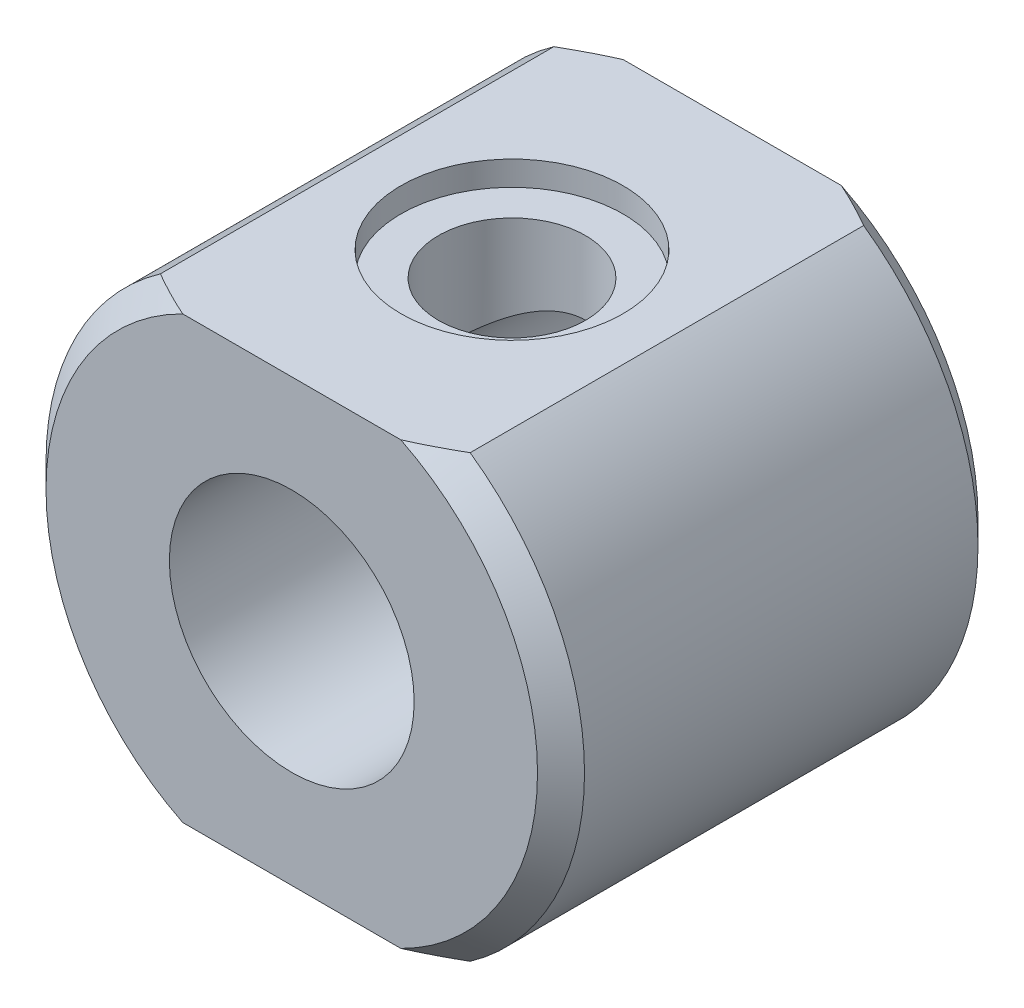
ISO-10303-21;
HEADER;
FILE_DESCRIPTION(('STEP AP214'),'2;1');
FILE_NAME('part.step','',(''),(''),'','','');
FILE_SCHEMA(('AUTOMOTIVE_DESIGN { 1 0 10303 214 1 1 1 1 }'));
ENDSEC;
DATA;
#1=APPLICATION_CONTEXT('core data for automotive mechanical design processes');
#2=APPLICATION_PROTOCOL_DEFINITION('international standard','automotive_design',2000,#1);
#3=PRODUCT_CONTEXT('',#1,'mechanical');
#4=PRODUCT('Part','Part','',(#3));
#5=PRODUCT_RELATED_PRODUCT_CATEGORY('part','',(#4));
#6=PRODUCT_DEFINITION_FORMATION('','',#4);
#7=PRODUCT_DEFINITION_CONTEXT('part definition',#1,'design');
#8=PRODUCT_DEFINITION('design','',#6,#7);
#9=PRODUCT_DEFINITION_SHAPE('','',#8);
#10=(LENGTH_UNIT() NAMED_UNIT(*) SI_UNIT(.MILLI.,.METRE.));
#11=(NAMED_UNIT(*) PLANE_ANGLE_UNIT() SI_UNIT($,.RADIAN.));
#12=(NAMED_UNIT(*) SI_UNIT($,.STERADIAN.) SOLID_ANGLE_UNIT());
#13=UNCERTAINTY_MEASURE_WITH_UNIT(LENGTH_MEASURE(1.E-05),#10,'distance_accuracy_value','');
#14=(GEOMETRIC_REPRESENTATION_CONTEXT(3) GLOBAL_UNCERTAINTY_ASSIGNED_CONTEXT((#13)) GLOBAL_UNIT_ASSIGNED_CONTEXT((#10,
#11,#12)) REPRESENTATION_CONTEXT('',''));
#15=CARTESIAN_POINT('',(0.,0.,0.));
#16=DIRECTION('',(0.,0.,1.));
#17=DIRECTION('',(1.,0.,0.));
#18=AXIS2_PLACEMENT_3D('',#15,#16,#17);
#19=CARTESIAN_POINT('',(0.,-14.28369,14.28369));
#20=DIRECTION('',(0.,1.,0.));
#21=DIRECTION('',(0.,0.,1.));
#22=AXIS2_PLACEMENT_3D('',#19,#20,#21);
#23=CYLINDRICAL_SURFACE('',#22,4.76885);
#24=CARTESIAN_POINT('',(0.,-7.9375,19.05254));
#25=CARTESIAN_POINT('',(0.122006599476514,-7.93749907523335,19.0525390079645));
#26=CARTESIAN_POINT('',(0.244043289197126,-7.93467985334668,19.0478505778045));
#27=CARTESIAN_POINT('',(0.487195443957951,-7.92346994194145,19.029156713414));
#28=CARTESIAN_POINT('',(0.608310333077408,-7.9150760190004,19.0151458720159));
#29=CARTESIAN_POINT('',(0.84886072700242,-7.8929054329971,18.9779634816516));
#30=CARTESIAN_POINT('',(0.968292639116388,-7.87911866155387,18.954774728592));
#31=CARTESIAN_POINT('',(1.20442837251289,-7.84649447156365,18.8995318190686));
#32=CARTESIAN_POINT('',(1.32113100269612,-7.82765489101964,18.8674738674646));
#33=CARTESIAN_POINT('',(1.55038269592291,-7.78548171014931,18.7950768748166));
#34=CARTESIAN_POINT('',(1.66295088410523,-7.76217308775489,18.7547837819003));
#35=CARTESIAN_POINT('',(1.88398753650359,-7.71150950102366,18.6662366638892));
#36=CARTESIAN_POINT('',(1.99245441751,-7.68415299372272,18.6179796022934));
#37=CARTESIAN_POINT('',(2.31071689049108,-7.59689058192846,18.4619964076783));
#38=CARTESIAN_POINT('',(2.51366236528502,-7.53173660343427,18.3429660439614));
#39=CARTESIAN_POINT('',(2.91249137350721,-7.38713529743319,18.0681956985907));
#40=CARTESIAN_POINT('',(3.10664381814082,-7.30697546782832,17.9103424931252));
#41=CARTESIAN_POINT('',(3.46743197525217,-7.14283949793634,17.5671206360599));
#42=CARTESIAN_POINT('',(3.63403177638562,-7.05885855619367,17.3817166635268));
#43=CARTESIAN_POINT('',(3.95573264685223,-6.8842953300686,16.9618341491075));
#44=CARTESIAN_POINT('',(4.10689789132294,-6.79417189406467,16.7241243464334));
#45=CARTESIAN_POINT('',(4.36657686543738,-6.63027782141909,16.2213771429684));
#46=CARTESIAN_POINT('',(4.47515992266154,-6.55648069022201,15.9563850558871));
#47=CARTESIAN_POINT('',(4.62358596933779,-6.45232584165802,15.4720094103288));
#48=CARTESIAN_POINT('',(4.67370583528169,-6.41577724149855,15.2571118669775));
#49=CARTESIAN_POINT('',(4.74374347179726,-6.36417868016527,14.8200264445534));
#50=CARTESIAN_POINT('',(4.76369894846188,-6.34910188017611,14.5978480224503));
#51=CARTESIAN_POINT('',(4.77225369462429,-6.34267625522399,14.1520934195173));
#52=CARTESIAN_POINT('',(4.76079084073196,-6.35137444038882,13.9285153428151));
#53=CARTESIAN_POINT('',(4.70710871218495,-6.39125099399484,13.487083666647));
#54=CARTESIAN_POINT('',(4.66486625039509,-6.42244630996897,13.2692345111976));
#55=CARTESIAN_POINT('',(4.55263797018624,-6.50246157198207,12.8475651811007));
#56=CARTESIAN_POINT('',(4.48302592597073,-6.55104330857641,12.6435977241367));
#57=CARTESIAN_POINT('',(4.31861283194991,-6.66057204134482,12.2497005541677));
#58=CARTESIAN_POINT('',(4.22380255956906,-6.72152356293717,12.059776013481));
#59=CARTESIAN_POINT('',(3.99256932175184,-6.86182380372892,11.6640176517541));
#60=CARTESIAN_POINT('',(3.85176578576827,-6.94252472070034,11.4612276658149));
#61=CARTESIAN_POINT('',(3.54098686683024,-7.10606357735018,11.0799653560036));
#62=CARTESIAN_POINT('',(3.37098351830567,-7.18890350039277,10.9015166412289));
#63=CARTESIAN_POINT('',(3.08315820343847,-7.31513005892278,10.6428328569681));
#64=CARTESIAN_POINT('',(2.97426425596982,-7.36018735097839,10.5533213990898));
#65=CARTESIAN_POINT('',(2.74827148578215,-7.44752042914028,10.3838354072285));
#66=CARTESIAN_POINT('',(2.63117586773262,-7.48979728927303,10.30385718093));
#67=CARTESIAN_POINT('',(2.38931471585024,-7.5704251300239,10.154121139949));
#68=CARTESIAN_POINT('',(2.26454817266489,-7.6087755922233,10.0843646743654));
#69=CARTESIAN_POINT('',(2.0081478488209,-7.68042627464793,9.95589447420392));
#70=CARTESIAN_POINT('',(1.87651836207239,-7.71372960291879,9.89717393826151));
#71=CARTESIAN_POINT('',(1.6156480520228,-7.77240846669807,9.79481446323044));
#72=CARTESIAN_POINT('',(1.48676866571649,-7.79814847071127,9.75046420784365));
#73=CARTESIAN_POINT('',(1.22475815094562,-7.84356650354084,9.67277320664526));
#74=CARTESIAN_POINT('',(1.09162945075467,-7.86324792843478,9.63942629226141));
#75=CARTESIAN_POINT('',(0.822298520901885,-7.89595588173495,9.5842605931209));
#76=CARTESIAN_POINT('',(0.686098633695371,-7.90898731414514,9.56243331285962));
#77=CARTESIAN_POINT('',(0.411839033745727,-7.92799970615286,9.53065229808399));
#78=CARTESIAN_POINT('',(0.273779587036004,-7.933981663655,9.52069688301811));
#79=CARTESIAN_POINT('',(0.0160981903366241,-7.9383826486269,9.51337065232846));
#80=CARTESIAN_POINT('',(-0.103467730528194,-7.93772267860363,9.51446733118448));
#81=CARTESIAN_POINT('',(-0.342068394764101,-7.93102404448858,9.52562455246726));
#82=CARTESIAN_POINT('',(-0.46110296274988,-7.92498371990838,9.5356878621816));
#83=CARTESIAN_POINT('',(-0.697658309651161,-7.90766916343841,9.56464436085098));
#84=CARTESIAN_POINT('',(-0.815179704274231,-7.8963971342418,9.58353383376831));
#85=CARTESIAN_POINT('',(-1.04794302735647,-7.86889381491302,9.62989005156444));
#86=CARTESIAN_POINT('',(-1.16318405855327,-7.85266061244001,9.65736010401577));
#87=CARTESIAN_POINT('',(-1.4985825762429,-7.79797550140655,9.75059008469834));
#88=CARTESIAN_POINT('',(-1.71459233856478,-7.75305219030499,9.82795639462007));
#89=CARTESIAN_POINT('',(-2.13038802329925,-7.6492772142964,10.0110877179225));
#90=CARTESIAN_POINT('',(-2.33017075336618,-7.59042281759683,10.116858301739));
#91=CARTESIAN_POINT('',(-2.73041358428338,-7.45638858833587,10.3660462818201));
#92=CARTESIAN_POINT('',(-2.92879526052688,-7.38014868309231,10.5122303311463));
#93=CARTESIAN_POINT('',(-3.29969977840574,-7.22195646677859,10.832022154664));
#94=CARTESIAN_POINT('',(-3.47219208639327,-7.13999757503494,11.0056618219579));
#95=CARTESIAN_POINT('',(-3.80966744324574,-6.96640787895467,11.4019076032403));
#96=CARTESIAN_POINT('',(-3.9707161839826,-6.87491441460423,11.6279478563438));
#97=CARTESIAN_POINT('',(-4.25268276362827,-6.70416267636115,12.1079281054921));
#98=CARTESIAN_POINT('',(-4.37364248281662,-6.62489168048416,12.3618386143632));
#99=CARTESIAN_POINT('',(-4.54906448456446,-6.50528460589184,12.835551962036));
#100=CARTESIAN_POINT('',(-4.61224482499362,-6.46023767626942,13.050885632125));
#101=CARTESIAN_POINT('',(-4.68401397161808,-6.40817885433192,13.3811002348471));
#102=CARTESIAN_POINT('',(-4.70410230846115,-6.39341211562222,13.492358729758));
#103=CARTESIAN_POINT('',(-4.73636483084277,-6.36955012645467,13.7166025215869));
#104=CARTESIAN_POINT('',(-4.74854205268772,-6.36045270015478,13.8295871389533));
#105=CARTESIAN_POINT('',(-4.76482418376982,-6.34826430216963,14.0569225492818));
#106=CARTESIAN_POINT('',(-4.76889606979478,-6.34519790303469,14.1712770292047));
#107=CARTESIAN_POINT('',(-4.76880314196242,-6.34526776028921,14.3999806049806));
#108=CARTESIAN_POINT('',(-4.76463831462031,-6.3484040268334,14.5143297008244));
#109=CARTESIAN_POINT('',(-4.74813620327871,-6.36075589709113,14.7421382909501));
#110=CARTESIAN_POINT('',(-4.73579664663121,-6.36997319138192,14.8555975289656));
#111=CARTESIAN_POINT('',(-4.70314494595272,-6.39411732123181,15.0807612576683));
#112=CARTESIAN_POINT('',(-4.68282968061206,-6.40904639204781,15.1924650435342));
#113=CARTESIAN_POINT('',(-4.61272605527989,-6.45987126260616,15.5128194918895));
#114=CARTESIAN_POINT('',(-4.55286413797522,-6.50254718279651,15.7182883539597));
#115=CARTESIAN_POINT('',(-4.40777286054244,-6.60175018610826,16.1163085014937));
#116=CARTESIAN_POINT('',(-4.32253393680249,-6.65828248974256,16.3088548833914));
#117=CARTESIAN_POINT('',(-4.11407429301403,-6.78937758542098,16.7073875838181));
#118=CARTESIAN_POINT('',(-3.98703320078618,-6.86537594769809,16.910905560889));
#119=CARTESIAN_POINT('',(-3.70495129412384,-7.02163235757532,17.2957204907678));
#120=CARTESIAN_POINT('',(-3.5498873971719,-7.10189387798593,17.4769989165294));
#121=CARTESIAN_POINT('',(-3.18602375018842,-7.27322370887429,17.8429146697379));
#122=CARTESIAN_POINT('',(-2.97258083961561,-7.36389965860548,18.023205661715));
#123=CARTESIAN_POINT('',(-2.62896487615379,-7.49049230232495,18.2649164640589));
#124=CARTESIAN_POINT('',(-2.51040850737972,-7.53114972073353,18.3407505449656));
#125=CARTESIAN_POINT('',(-2.26603881659174,-7.60824181288898,18.4821289725922));
#126=CARTESIAN_POINT('',(-2.14022963962433,-7.6446788634758,18.5476791184981));
#127=CARTESIAN_POINT('',(-1.88584350178684,-7.711309366379,18.6659991107991));
#128=CARTESIAN_POINT('',(-1.75745285758622,-7.74165334014552,18.7190846770312));
#129=CARTESIAN_POINT('',(-1.49547639647825,-7.79649572231087,18.8141289470608));
#130=CARTESIAN_POINT('',(-1.36189366365395,-7.82099754103368,18.8560941439104));
#131=CARTESIAN_POINT('',(-1.09096990500281,-7.86336044572979,18.9281823920399));
#132=CARTESIAN_POINT('',(-0.95364109049625,-7.88124085411491,18.9583399151334));
#133=CARTESIAN_POINT('',(-0.676208897663357,-7.90987101496825,19.0064498527642));
#134=CARTESIAN_POINT('',(-0.536107921683076,-7.92062668503777,19.0244123964077));
#135=CARTESIAN_POINT('',(-0.329661006307139,-7.93092487962723,19.0415895438556));
#136=CARTESIAN_POINT('',(-0.263825594761809,-7.93338837288751,19.0456937270429));
#137=CARTESIAN_POINT('',(-0.131996394577459,-7.93667621276283,19.0511692727164));
#138=CARTESIAN_POINT('',(-0.06600260031383,-7.93750050027625,19.052540536667));
#139=CARTESIAN_POINT('',(0.,-7.9375,19.05254));
#140=B_SPLINE_CURVE_WITH_KNOTS('',3,(#24,#25,#26,#27,#28,#29,#30,#31,#32,#33,#34,#35,#36,#37,
#38,#39,#40,#41,#42,#43,#44,#45,#46,#47,#48,#49,#50,#51,#52,#53,#54,#55,#56,#57,#58,#59,#60,#61,
#62,#63,#64,#65,#66,#67,#68,#69,#70,#71,#72,#73,#74,#75,#76,#77,#78,#79,#80,#81,#82,#83,#84,#85,
#86,#87,#88,#89,#90,#91,#92,#93,#94,#95,#96,#97,#98,#99,#100,#101,#102,#103,#104,#105,#106,#107,
#108,#109,#110,#111,#112,#113,#114,#115,#116,#117,#118,#119,#120,#121,#122,#123,#124,#125,#126,
#127,#128,#129,#130,#131,#132,#133,#134,#135,#136,#137,#138,#139),.UNSPECIFIED.,.T.,.F.,(4,2,2,
2,2,2,2,2,2,2,2,2,2,2,2,2,2,2,2,2,2,2,2,2,2,2,2,2,2,2,2,2,2,2,2,2,2,2,2,2,2,2,2,2,2,2,2,2,2,2,2,
2,2,2,2,2,2,4),(0.,0.365950301775763,0.732113046609754,1.0989654430988,1.46597505958587,
1.83099025782359,2.19614495192134,2.92554234784512,3.71079914403263,4.49707149070489,
5.38007020383055,6.26162528836569,6.92979837147888,7.59713553209239,8.2657931682901,
8.93495504436289,9.59527930979997,10.2558455881634,11.03216133398,11.8092247701281,
12.2527104026523,12.6960237067772,13.1393954681296,13.5824930801188,13.9980060045178,
14.4132855912838,14.8282584880075,15.2431726352306,15.6014426127744,15.9598231981496,
16.3180530320152,16.6764211241899,17.3746513194949,18.073018546657,18.843811019984,
19.6155055327012,20.488152176022,21.3598842862112,22.0434379168005,22.3851231893353,
22.7266772445835,23.069620053226,23.4125634233205,23.7556021747776,24.0987753091798,
24.7506523247526,25.4027753191979,26.1549212756683,26.9076896258673,27.7842005334121,
28.223191715694,28.6619344508994,29.0879429517219,29.5137021603839,29.9382089526873,
30.3623627183768,30.5603257858827,30.7582959908263),.UNSPECIFIED.);
#141=CARTESIAN_POINT('',(0.,-7.9375,19.05254));
#142=VERTEX_POINT('',#141);
#143=EDGE_CURVE('E242',#142,#142,#140,.T.);
#144=ORIENTED_EDGE('',*,*,#143,.T.);
#145=EDGE_LOOP('',(#144));
#146=FACE_BOUND('',#145,.T.);
#147=CARTESIAN_POINT('',(0.,-14.28369,14.28369));
#148=DIRECTION('',(0.,1.,0.));
#149=DIRECTION('',(0.,0.,1.));
#150=AXIS2_PLACEMENT_3D('',#147,#148,#149);
#151=CIRCLE('',#150,4.76885);
#152=CARTESIAN_POINT('',(0.,-14.28369,19.05254));
#153=VERTEX_POINT('',#152);
#154=EDGE_CURVE('E215',#153,#153,#151,.T.);
#155=ORIENTED_EDGE('',*,*,#154,.F.);
#156=EDGE_LOOP('',(#155));
#157=FACE_BOUND('',#156,.T.);
#158=ADVANCED_FACE('F41',(#146,#157),#23,.F.);
#159=CARTESIAN_POINT('',(0.,7.9375,19.05254));
#160=CARTESIAN_POINT('',(-0.122006599476514,7.93749907523335,19.0525390079645));
#161=CARTESIAN_POINT('',(-0.244043289197126,7.93467985334668,19.0478505778045));
#162=CARTESIAN_POINT('',(-0.487195443957951,7.92346994194145,19.029156713414));
#163=CARTESIAN_POINT('',(-0.608310333077408,7.9150760190004,19.0151458720159));
#164=CARTESIAN_POINT('',(-0.84886072700242,7.8929054329971,18.9779634816516));
#165=CARTESIAN_POINT('',(-0.968292639116388,7.87911866155387,18.954774728592));
#166=CARTESIAN_POINT('',(-1.20442837251289,7.84649447156365,18.8995318190686));
#167=CARTESIAN_POINT('',(-1.32113100269612,7.82765489101964,18.8674738674646));
#168=CARTESIAN_POINT('',(-1.55038269592291,7.78548171014931,18.7950768748166));
#169=CARTESIAN_POINT('',(-1.66295088410523,7.76217308775489,18.7547837819003));
#170=CARTESIAN_POINT('',(-1.88398753650359,7.71150950102366,18.6662366638892));
#171=CARTESIAN_POINT('',(-1.99245441751,7.68415299372272,18.6179796022934));
#172=CARTESIAN_POINT('',(-2.31071689049108,7.59689058192846,18.4619964076783));
#173=CARTESIAN_POINT('',(-2.51366236528502,7.53173660343427,18.3429660439614));
#174=CARTESIAN_POINT('',(-2.91249137350721,7.38713529743319,18.0681956985907));
#175=CARTESIAN_POINT('',(-3.10664381814082,7.30697546782832,17.9103424931252));
#176=CARTESIAN_POINT('',(-3.46743197525217,7.14283949793634,17.5671206360599));
#177=CARTESIAN_POINT('',(-3.63403177638562,7.05885855619367,17.3817166635268));
#178=CARTESIAN_POINT('',(-3.95573264685223,6.8842953300686,16.9618341491075));
#179=CARTESIAN_POINT('',(-4.10689789132294,6.79417189406467,16.7241243464334));
#180=CARTESIAN_POINT('',(-4.36657686543738,6.63027782141909,16.2213771429684));
#181=CARTESIAN_POINT('',(-4.47515992266154,6.55648069022201,15.9563850558871));
#182=CARTESIAN_POINT('',(-4.62358596933779,6.45232584165802,15.4720094103288));
#183=CARTESIAN_POINT('',(-4.67370583528169,6.41577724149855,15.2571118669775));
#184=CARTESIAN_POINT('',(-4.74374347179726,6.36417868016527,14.8200264445534));
#185=CARTESIAN_POINT('',(-4.76369894846188,6.34910188017611,14.5978480224503));
#186=CARTESIAN_POINT('',(-4.77225369462429,6.34267625522399,14.1520934195173));
#187=CARTESIAN_POINT('',(-4.76079084073196,6.35137444038882,13.9285153428151));
#188=CARTESIAN_POINT('',(-4.70710871218495,6.39125099399484,13.487083666647));
#189=CARTESIAN_POINT('',(-4.66486625039509,6.42244630996897,13.2692345111976));
#190=CARTESIAN_POINT('',(-4.55263797018624,6.50246157198207,12.8475651811007));
#191=CARTESIAN_POINT('',(-4.48302592597073,6.55104330857641,12.6435977241367));
#192=CARTESIAN_POINT('',(-4.31861283194991,6.66057204134482,12.2497005541677));
#193=CARTESIAN_POINT('',(-4.22380255956906,6.72152356293717,12.059776013481));
#194=CARTESIAN_POINT('',(-3.99256932175184,6.86182380372892,11.6640176517541));
#195=CARTESIAN_POINT('',(-3.85176578576827,6.94252472070034,11.4612276658149));
#196=CARTESIAN_POINT('',(-3.54098686683024,7.10606357735018,11.0799653560036));
#197=CARTESIAN_POINT('',(-3.37098351830567,7.18890350039277,10.9015166412289));
#198=CARTESIAN_POINT('',(-3.08315820343847,7.31513005892278,10.6428328569681));
#199=CARTESIAN_POINT('',(-2.97426425596982,7.36018735097839,10.5533213990898));
#200=CARTESIAN_POINT('',(-2.74827148578215,7.44752042914028,10.3838354072285));
#201=CARTESIAN_POINT('',(-2.63117586773262,7.48979728927303,10.30385718093));
#202=CARTESIAN_POINT('',(-2.38931471585024,7.5704251300239,10.154121139949));
#203=CARTESIAN_POINT('',(-2.26454817266489,7.6087755922233,10.0843646743654));
#204=CARTESIAN_POINT('',(-2.0081478488209,7.68042627464793,9.95589447420392));
#205=CARTESIAN_POINT('',(-1.87651836207239,7.71372960291879,9.89717393826151));
#206=CARTESIAN_POINT('',(-1.6156480520228,7.77240846669807,9.79481446323044));
#207=CARTESIAN_POINT('',(-1.48676866571649,7.79814847071127,9.75046420784365));
#208=CARTESIAN_POINT('',(-1.22475815094562,7.84356650354084,9.67277320664526));
#209=CARTESIAN_POINT('',(-1.09162945075467,7.86324792843478,9.63942629226141));
#210=CARTESIAN_POINT('',(-0.822298520901885,7.89595588173495,9.5842605931209));
#211=CARTESIAN_POINT('',(-0.686098633695371,7.90898731414514,9.56243331285962));
#212=CARTESIAN_POINT('',(-0.411839033745727,7.92799970615286,9.53065229808399));
#213=CARTESIAN_POINT('',(-0.273779587036004,7.933981663655,9.52069688301811));
#214=CARTESIAN_POINT('',(-0.0160981903366241,7.9383826486269,9.51337065232846));
#215=CARTESIAN_POINT('',(0.103467730528194,7.93772267860363,9.51446733118448));
#216=CARTESIAN_POINT('',(0.342068394764101,7.93102404448858,9.52562455246726));
#217=CARTESIAN_POINT('',(0.46110296274988,7.92498371990838,9.5356878621816));
#218=CARTESIAN_POINT('',(0.697658309651161,7.90766916343841,9.56464436085098));
#219=CARTESIAN_POINT('',(0.815179704274231,7.8963971342418,9.58353383376831));
#220=CARTESIAN_POINT('',(1.04794302735647,7.86889381491302,9.62989005156444));
#221=CARTESIAN_POINT('',(1.16318405855327,7.85266061244001,9.65736010401577));
#222=CARTESIAN_POINT('',(1.4985825762429,7.79797550140655,9.75059008469834));
#223=CARTESIAN_POINT('',(1.71459233856478,7.75305219030499,9.82795639462007));
#224=CARTESIAN_POINT('',(2.13038802329925,7.6492772142964,10.0110877179225));
#225=CARTESIAN_POINT('',(2.33017075336618,7.59042281759683,10.116858301739));
#226=CARTESIAN_POINT('',(2.73041358428338,7.45638858833587,10.3660462818201));
#227=CARTESIAN_POINT('',(2.92879526052688,7.38014868309231,10.5122303311463));
#228=CARTESIAN_POINT('',(3.29969977840574,7.22195646677859,10.832022154664));
#229=CARTESIAN_POINT('',(3.47219208639327,7.13999757503494,11.0056618219579));
#230=CARTESIAN_POINT('',(3.80966744324574,6.96640787895467,11.4019076032403));
#231=CARTESIAN_POINT('',(3.9707161839826,6.87491441460423,11.6279478563438));
#232=CARTESIAN_POINT('',(4.25268276362827,6.70416267636115,12.1079281054921));
#233=CARTESIAN_POINT('',(4.37364248281662,6.62489168048416,12.3618386143632));
#234=CARTESIAN_POINT('',(4.54906448456446,6.50528460589184,12.835551962036));
#235=CARTESIAN_POINT('',(4.61224482499362,6.46023767626942,13.050885632125));
#236=CARTESIAN_POINT('',(4.68401397161808,6.40817885433192,13.3811002348471));
#237=CARTESIAN_POINT('',(4.70410230846115,6.39341211562222,13.492358729758));
#238=CARTESIAN_POINT('',(4.73636483084277,6.36955012645467,13.7166025215869));
#239=CARTESIAN_POINT('',(4.74854205268772,6.36045270015478,13.8295871389533));
#240=CARTESIAN_POINT('',(4.76482418376982,6.34826430216963,14.0569225492818));
#241=CARTESIAN_POINT('',(4.76889606979478,6.34519790303469,14.1712770292047));
#242=CARTESIAN_POINT('',(4.76880314196242,6.34526776028921,14.3999806049806));
#243=CARTESIAN_POINT('',(4.76463831462031,6.3484040268334,14.5143297008244));
#244=CARTESIAN_POINT('',(4.74813620327871,6.36075589709113,14.7421382909501));
#245=CARTESIAN_POINT('',(4.73579664663121,6.36997319138192,14.8555975289656));
#246=CARTESIAN_POINT('',(4.70314494595272,6.39411732123181,15.0807612576683));
#247=CARTESIAN_POINT('',(4.68282968061206,6.40904639204781,15.1924650435342));
#248=CARTESIAN_POINT('',(4.61272605527989,6.45987126260616,15.5128194918895));
#249=CARTESIAN_POINT('',(4.55286413797522,6.50254718279651,15.7182883539597));
#250=CARTESIAN_POINT('',(4.40777286054244,6.60175018610826,16.1163085014937));
#251=CARTESIAN_POINT('',(4.32253393680249,6.65828248974256,16.3088548833914));
#252=CARTESIAN_POINT('',(4.11407429301403,6.78937758542098,16.7073875838181));
#253=CARTESIAN_POINT('',(3.98703320078618,6.86537594769809,16.910905560889));
#254=CARTESIAN_POINT('',(3.70495129412384,7.02163235757532,17.2957204907678));
#255=CARTESIAN_POINT('',(3.5498873971719,7.10189387798593,17.4769989165294));
#256=CARTESIAN_POINT('',(3.18602375018842,7.27322370887429,17.8429146697379));
#257=CARTESIAN_POINT('',(2.97258083961561,7.36389965860548,18.023205661715));
#258=CARTESIAN_POINT('',(2.62896487615379,7.49049230232495,18.2649164640589));
#259=CARTESIAN_POINT('',(2.51040850737972,7.53114972073353,18.3407505449656));
#260=CARTESIAN_POINT('',(2.26603881659174,7.60824181288898,18.4821289725922));
#261=CARTESIAN_POINT('',(2.14022963962433,7.6446788634758,18.5476791184981));
#262=CARTESIAN_POINT('',(1.88584350178684,7.711309366379,18.6659991107991));
#263=CARTESIAN_POINT('',(1.75745285758622,7.74165334014552,18.7190846770312));
#264=CARTESIAN_POINT('',(1.49547639647825,7.79649572231087,18.8141289470608));
#265=CARTESIAN_POINT('',(1.36189366365395,7.82099754103368,18.8560941439104));
#266=CARTESIAN_POINT('',(1.09096990500281,7.86336044572979,18.9281823920399));
#267=CARTESIAN_POINT('',(0.95364109049625,7.88124085411491,18.9583399151334));
#268=CARTESIAN_POINT('',(0.676208897663357,7.90987101496825,19.0064498527642));
#269=CARTESIAN_POINT('',(0.536107921683076,7.92062668503777,19.0244123964077));
#270=CARTESIAN_POINT('',(0.329661006307139,7.93092487962723,19.0415895438556));
#271=CARTESIAN_POINT('',(0.263825594761809,7.93338837288751,19.0456937270429));
#272=CARTESIAN_POINT('',(0.131996394577459,7.93667621276283,19.0511692727164));
#273=CARTESIAN_POINT('',(0.06600260031383,7.93750050027625,19.052540536667));
#274=CARTESIAN_POINT('',(0.,7.9375,19.05254));
#275=B_SPLINE_CURVE_WITH_KNOTS('',3,(#159,#160,#161,#162,#163,#164,#165,#166,#167,#168,#169,
#170,#171,#172,#173,#174,#175,#176,#177,#178,#179,#180,#181,#182,#183,#184,#185,#186,#187,#188,
#189,#190,#191,#192,#193,#194,#195,#196,#197,#198,#199,#200,#201,#202,#203,#204,#205,#206,#207,
#208,#209,#210,#211,#212,#213,#214,#215,#216,#217,#218,#219,#220,#221,#222,#223,#224,#225,#226,
#227,#228,#229,#230,#231,#232,#233,#234,#235,#236,#237,#238,#239,#240,#241,#242,#243,#244,#245,
#246,#247,#248,#249,#250,#251,#252,#253,#254,#255,#256,#257,#258,#259,#260,#261,#262,#263,#264,
#265,#266,#267,#268,#269,#270,#271,#272,#273,#274),.UNSPECIFIED.,.T.,.F.,(4,2,2,2,2,2,2,2,2,2,2,
2,2,2,2,2,2,2,2,2,2,2,2,2,2,2,2,2,2,2,2,2,2,2,2,2,2,2,2,2,2,2,2,2,2,2,2,2,2,2,2,2,2,2,2,2,2,4),
(0.,0.365950301775763,0.732113046609754,1.0989654430988,1.46597505958587,1.83099025782359,
2.19614495192134,2.92554234784512,3.71079914403263,4.49707149070489,5.38007020383055,
6.26162528836569,6.92979837147888,7.59713553209239,8.2657931682901,8.93495504436289,
9.59527930979997,10.2558455881634,11.03216133398,11.8092247701281,12.2527104026523,
12.6960237067772,13.1393954681296,13.5824930801188,13.9980060045178,14.4132855912838,
14.8282584880075,15.2431726352306,15.6014426127744,15.9598231981496,16.3180530320152,
16.6764211241899,17.3746513194949,18.073018546657,18.843811019984,19.6155055327012,
20.488152176022,21.3598842862112,22.0434379168005,22.3851231893353,22.7266772445835,
23.069620053226,23.4125634233205,23.7556021747776,24.0987753091798,24.7506523247526,
25.4027753191979,26.1549212756683,26.9076896258673,27.7842005334121,28.223191715694,
28.6619344508994,29.0879429517219,29.5137021603839,29.9382089526873,30.3623627183768,
30.5603257858827,30.7582959908263),.UNSPECIFIED.);
#276=CARTESIAN_POINT('',(0.,7.9375,19.05254));
#277=VERTEX_POINT('',#276);
#278=EDGE_CURVE('E250',#277,#277,#275,.T.);
#279=ORIENTED_EDGE('',*,*,#278,.T.);
#280=EDGE_LOOP('',(#279));
#281=FACE_BOUND('',#280,.T.);
#282=CARTESIAN_POINT('',(0.,12.69619,14.28369));
#283=DIRECTION('',(0.,1.,0.));
#284=DIRECTION('',(0.,0.,1.));
#285=AXIS2_PLACEMENT_3D('',#282,#283,#284);
#286=CIRCLE('',#285,4.76885);
#287=CARTESIAN_POINT('',(0.,12.69619,19.05254));
#288=VERTEX_POINT('',#287);
#289=EDGE_CURVE('E219',#288,#288,#286,.F.);
#290=ORIENTED_EDGE('',*,*,#289,.F.);
#291=EDGE_LOOP('',(#290));
#292=FACE_BOUND('',#291,.T.);
#293=ADVANCED_FACE('F255',(#281,#292),#23,.F.);
#294=CARTESIAN_POINT('',(0.,0.,28.56738));
#295=DIRECTION('',(0.,0.,-1.));
#296=DIRECTION('',(-1.,0.,0.));
#297=AXIS2_PLACEMENT_3D('',#294,#295,#296);
#298=CYLINDRICAL_SURFACE('',#297,17.4625);
#299=DIRECTION('',(0.,0.,1.));
#300=VECTOR('',#299,1.);
#301=CARTESIAN_POINT('',(-10.0456511105005,14.28369,-0.00761999999999985));
#302=LINE('',#301,#300);
#303=CARTESIAN_POINT('',(-10.0456511105005,14.28369,1.52400000000001));
#304=VERTEX_POINT('',#303);
#305=CARTESIAN_POINT('',(-10.0456511105005,14.28369,27.04338));
#306=VERTEX_POINT('',#305);
#307=EDGE_CURVE('E224',#304,#306,#302,.T.);
#308=ORIENTED_EDGE('',*,*,#307,.F.);
#309=CARTESIAN_POINT('',(0.,0.,1.52400000000001));
#310=DIRECTION('',(0.,0.,1.));
#311=DIRECTION('',(1.,0.,0.));
#312=AXIS2_PLACEMENT_3D('',#309,#310,#311);
#313=CIRCLE('',#312,17.4625);
#314=CARTESIAN_POINT('',(-10.0456511105005,-14.28369,1.52400000000001));
#315=VERTEX_POINT('',#314);
#316=EDGE_CURVE('E204',#304,#315,#313,.T.);
#317=ORIENTED_EDGE('',*,*,#316,.T.);
#318=DIRECTION('',(0.,0.,1.));
#319=VECTOR('',#318,1.);
#320=CARTESIAN_POINT('',(-10.0456511105005,-14.28369,-0.00761999999999985));
#321=LINE('',#320,#319);
#322=CARTESIAN_POINT('',(-10.0456511105005,-14.28369,27.04338));
#323=VERTEX_POINT('',#322);
#324=EDGE_CURVE('E130',#315,#323,#321,.T.);
#325=ORIENTED_EDGE('',*,*,#324,.T.);
#326=CARTESIAN_POINT('',(0.,0.,27.04338));
#327=DIRECTION('',(0.,0.,1.));
#328=DIRECTION('',(1.,0.,0.));
#329=AXIS2_PLACEMENT_3D('',#326,#327,#328);
#330=CIRCLE('',#329,17.4625);
#331=EDGE_CURVE('E119',#323,#306,#330,.F.);
#332=ORIENTED_EDGE('',*,*,#331,.T.);
#333=EDGE_LOOP('',(#308,#317,#325,#332));
#334=FACE_BOUND('',#333,.T.);
#335=ADVANCED_FACE('F277',(#334),#298,.T.);
#336=DIRECTION('',(0.,0.,1.));
#337=VECTOR('',#336,1.);
#338=CARTESIAN_POINT('',(10.0456511105005,-14.28369,-0.00761999999999985));
#339=LINE('',#338,#337);
#340=CARTESIAN_POINT('',(10.0456511105005,-14.28369,1.52400000000001));
#341=VERTEX_POINT('',#340);
#342=CARTESIAN_POINT('',(10.0456511105005,-14.28369,27.04338));
#343=VERTEX_POINT('',#342);
#344=EDGE_CURVE('E112',#341,#343,#339,.T.);
#345=ORIENTED_EDGE('',*,*,#344,.F.);
#346=CARTESIAN_POINT('',(0.,0.,1.52400000000001));
#347=DIRECTION('',(0.,0.,1.));
#348=DIRECTION('',(1.,0.,0.));
#349=AXIS2_PLACEMENT_3D('',#346,#347,#348);
#350=CIRCLE('',#349,17.4625);
#351=CARTESIAN_POINT('',(10.0456511105005,14.28369,1.52400000000001));
#352=VERTEX_POINT('',#351);
#353=EDGE_CURVE('E125',#341,#352,#350,.T.);
#354=ORIENTED_EDGE('',*,*,#353,.T.);
#355=DIRECTION('',(0.,0.,1.));
#356=VECTOR('',#355,1.);
#357=CARTESIAN_POINT('',(10.0456511105005,14.28369,-0.00761999999999985));
#358=LINE('',#357,#356);
#359=CARTESIAN_POINT('',(10.0456511105005,14.28369,27.04338));
#360=VERTEX_POINT('',#359);
#361=EDGE_CURVE('E225',#352,#360,#358,.T.);
#362=ORIENTED_EDGE('',*,*,#361,.T.);
#363=CARTESIAN_POINT('',(0.,0.,27.04338));
#364=DIRECTION('',(0.,0.,1.));
#365=DIRECTION('',(1.,0.,0.));
#366=AXIS2_PLACEMENT_3D('',#363,#364,#365);
#367=CIRCLE('',#366,17.4625);
#368=EDGE_CURVE('E128',#360,#343,#367,.F.);
#369=ORIENTED_EDGE('',*,*,#368,.T.);
#370=EDGE_LOOP('',(#345,#354,#362,#369));
#371=FACE_BOUND('',#370,.T.);
#372=ADVANCED_FACE('F123',(#371),#298,.T.);
#373=CARTESIAN_POINT('',(0.,0.,28.56738));
#374=DIRECTION('',(0.,0.,1.));
#375=DIRECTION('',(1.,0.,0.));
#376=AXIS2_PLACEMENT_3D('',#373,#374,#375);
#377=PLANE('',#376);
#378=CARTESIAN_POINT('',(0.,0.,28.56738));
#379=DIRECTION('',(0.,0.,1.));
#380=DIRECTION('',(1.,0.,0.));
#381=AXIS2_PLACEMENT_3D('',#378,#379,#380);
#382=CIRCLE('',#381,7.9375);
#383=CARTESIAN_POINT('',(7.9375,0.,28.56738));
#384=VERTEX_POINT('',#383);
#385=EDGE_CURVE('E398',#384,#384,#382,.T.);
#386=ORIENTED_EDGE('',*,*,#385,.F.);
#387=EDGE_LOOP('',(#386));
#388=FACE_BOUND('',#387,.T.);
#389=DIRECTION('',(1.,0.,0.));
#390=VECTOR('',#389,1.);
#391=CARTESIAN_POINT('',(0.,-14.28369,28.56738));
#392=LINE('',#391,#390);
#393=CARTESIAN_POINT('',(-7.0719150329949,-14.28369,28.56738));
#394=VERTEX_POINT('',#393);
#395=CARTESIAN_POINT('',(7.0719150329949,-14.28369,28.56738));
#396=VERTEX_POINT('',#395);
#397=EDGE_CURVE('E210',#394,#396,#392,.T.);
#398=ORIENTED_EDGE('',*,*,#397,.T.);
#399=CARTESIAN_POINT('',(0.,0.,28.56738));
#400=DIRECTION('',(0.,0.,1.));
#401=DIRECTION('',(1.,0.,0.));
#402=AXIS2_PLACEMENT_3D('',#399,#400,#401);
#403=CIRCLE('',#402,15.9385);
#404=CARTESIAN_POINT('',(7.07191503299491,14.28369,28.56738));
#405=VERTEX_POINT('',#404);
#406=EDGE_CURVE('E11',#396,#405,#403,.T.);
#407=ORIENTED_EDGE('',*,*,#406,.T.);
#408=DIRECTION('',(1.,0.,0.));
#409=VECTOR('',#408,1.);
#410=CARTESIAN_POINT('',(0.,14.28369,28.56738));
#411=LINE('',#410,#409);
#412=CARTESIAN_POINT('',(-7.07191503299492,14.28369,28.56738));
#413=VERTEX_POINT('',#412);
#414=EDGE_CURVE('E129',#413,#405,#411,.T.);
#415=ORIENTED_EDGE('',*,*,#414,.F.);
#416=CARTESIAN_POINT('',(0.,0.,28.56738));
#417=DIRECTION('',(0.,0.,1.));
#418=DIRECTION('',(1.,0.,0.));
#419=AXIS2_PLACEMENT_3D('',#416,#417,#418);
#420=CIRCLE('',#419,15.9385);
#421=EDGE_CURVE('E50',#413,#394,#420,.T.);
#422=ORIENTED_EDGE('',*,*,#421,.T.);
#423=EDGE_LOOP('',(#398,#407,#415,#422));
#424=FACE_BOUND('',#423,.T.);
#425=ADVANCED_FACE('F160',(#388,#424),#377,.T.);
#426=CARTESIAN_POINT('',(0.,0.,0.));
#427=DIRECTION('',(0.,0.,1.));
#428=DIRECTION('',(1.,0.,0.));
#429=AXIS2_PLACEMENT_3D('',#426,#427,#428);
#430=PLANE('',#429);
#431=CARTESIAN_POINT('',(0.,0.,0.));
#432=DIRECTION('',(0.,0.,1.));
#433=DIRECTION('',(1.,0.,0.));
#434=AXIS2_PLACEMENT_3D('',#431,#432,#433);
#435=CIRCLE('',#434,7.9375);
#436=CARTESIAN_POINT('',(7.9375,0.,0.));
#437=VERTEX_POINT('',#436);
#438=EDGE_CURVE('E359',#437,#437,#435,.T.);
#439=ORIENTED_EDGE('',*,*,#438,.T.);
#440=EDGE_LOOP('',(#439));
#441=FACE_BOUND('',#440,.T.);
#442=DIRECTION('',(1.,0.,0.));
#443=VECTOR('',#442,1.);
#444=CARTESIAN_POINT('',(0.,14.28369,0.));
#445=LINE('',#444,#443);
#446=CARTESIAN_POINT('',(-7.07191503299494,14.28369,0.));
#447=VERTEX_POINT('',#446);
#448=CARTESIAN_POINT('',(7.07191503299494,14.28369,0.));
#449=VERTEX_POINT('',#448);
#450=EDGE_CURVE('E227',#447,#449,#445,.T.);
#451=ORIENTED_EDGE('',*,*,#450,.T.);
#452=CARTESIAN_POINT('',(0.,0.,0.));
#453=DIRECTION('',(0.,0.,1.));
#454=DIRECTION('',(1.,0.,0.));
#455=AXIS2_PLACEMENT_3D('',#452,#453,#454);
#456=CIRCLE('',#455,15.9385);
#457=CARTESIAN_POINT('',(7.07191503299492,-14.28369,0.));
#458=VERTEX_POINT('',#457);
#459=EDGE_CURVE('E361',#449,#458,#456,.F.);
#460=ORIENTED_EDGE('',*,*,#459,.T.);
#461=DIRECTION('',(1.,0.,0.));
#462=VECTOR('',#461,1.);
#463=CARTESIAN_POINT('',(0.,-14.28369,0.));
#464=LINE('',#463,#462);
#465=CARTESIAN_POINT('',(-7.07191503299492,-14.28369,0.));
#466=VERTEX_POINT('',#465);
#467=EDGE_CURVE('E115',#466,#458,#464,.T.);
#468=ORIENTED_EDGE('',*,*,#467,.F.);
#469=CARTESIAN_POINT('',(0.,0.,0.));
#470=DIRECTION('',(0.,0.,1.));
#471=DIRECTION('',(1.,0.,0.));
#472=AXIS2_PLACEMENT_3D('',#469,#470,#471);
#473=CIRCLE('',#472,15.9385);
#474=EDGE_CURVE('E362',#466,#447,#473,.F.);
#475=ORIENTED_EDGE('',*,*,#474,.T.);
#476=EDGE_LOOP('',(#451,#460,#468,#475));
#477=FACE_BOUND('',#476,.T.);
#478=ADVANCED_FACE('F156',(#441,#477),#430,.F.);
#479=CARTESIAN_POINT('',(0.,14.28369,-0.00761999999999985));
#480=DIRECTION('',(0.,-1.,0.));
#481=DIRECTION('',(0.,0.,-1.));
#482=AXIS2_PLACEMENT_3D('',#479,#480,#481);
#483=PLANE('',#482);
#484=CARTESIAN_POINT('',(0.,14.28369,14.28369));
#485=DIRECTION('',(0.,1.,0.));
#486=DIRECTION('',(0.,0.,1.));
#487=AXIS2_PLACEMENT_3D('',#484,#485,#486);
#488=CIRCLE('',#487,7.2009);
#489=CARTESIAN_POINT('',(0.,14.28369,21.48459));
#490=VERTEX_POINT('',#489);
#491=EDGE_CURVE('E237',#490,#490,#488,.T.);
#492=ORIENTED_EDGE('',*,*,#491,.F.);
#493=EDGE_LOOP('',(#492));
#494=FACE_BOUND('',#493,.T.);
#495=ORIENTED_EDGE('',*,*,#361,.F.);
#496=CARTESIAN_POINT('',(10.0456511105005,14.28369,1.52400000000001));
#497=CARTESIAN_POINT('',(9.80410522752079,14.28369,1.3850605942032));
#498=CARTESIAN_POINT('',(9.5611085043591,14.28369,1.24861051907278));
#499=CARTESIAN_POINT('',(9.07217461683725,14.28369,0.981491968403448));
#500=CARTESIAN_POINT('',(8.82623955483409,14.28369,0.850819640737012));
#501=CARTESIAN_POINT('',(8.3310392722769,14.28369,0.595856879348774));
#502=CARTESIAN_POINT('',(8.08177372578989,14.28369,0.471567076094139));
#503=CARTESIAN_POINT('',(7.57958948557047,14.28369,0.23016061304323));
#504=CARTESIAN_POINT('',(7.32666843006136,14.28369,0.113048872723101));
#505=CARTESIAN_POINT('',(7.07191503299494,14.28369,0.));
#506=B_SPLINE_CURVE_WITH_KNOTS('',3,(#496,#497,#498,#499,#500,#501,#502,#503,#504,#505),
.UNSPECIFIED.,.F.,.F.,(4,2,2,2,4),(0.,0.835973518869649,1.67138100545649,2.50687085566413,
3.34292704859531),.UNSPECIFIED.);
#507=EDGE_CURVE('E133',#352,#449,#506,.T.);
#508=ORIENTED_EDGE('',*,*,#507,.T.);
#509=ORIENTED_EDGE('',*,*,#450,.F.);
#510=CARTESIAN_POINT('',(-7.07191503299494,14.28369,0.));
#511=CARTESIAN_POINT('',(-7.32666843006136,14.28369,0.113048872723102));
#512=CARTESIAN_POINT('',(-7.57958948557047,14.28369,0.23016061304323));
#513=CARTESIAN_POINT('',(-8.08177372578989,14.28369,0.471567076094139));
#514=CARTESIAN_POINT('',(-8.3310392722769,14.28369,0.595856879348774));
#515=CARTESIAN_POINT('',(-8.82623955483409,14.28369,0.850819640737013));
#516=CARTESIAN_POINT('',(-9.07217461683725,14.28369,0.981491968403448));
#517=CARTESIAN_POINT('',(-9.5611085043591,14.28369,1.24861051907278));
#518=CARTESIAN_POINT('',(-9.80410522752079,14.28369,1.3850605942032));
#519=CARTESIAN_POINT('',(-10.0456511105005,14.28369,1.52400000000001));
#520=B_SPLINE_CURVE_WITH_KNOTS('',3,(#510,#511,#512,#513,#514,#515,#516,#517,#518,#519),
.UNSPECIFIED.,.F.,.F.,(4,2,2,2,4),(0.,0.836056192931173,1.67154604313882,2.50695352972566,
3.34292704859531),.UNSPECIFIED.);
#521=EDGE_CURVE('E166',#447,#304,#520,.T.);
#522=ORIENTED_EDGE('',*,*,#521,.T.);
#523=ORIENTED_EDGE('',*,*,#307,.T.);
#524=CARTESIAN_POINT('',(-10.0456511105005,14.28369,27.04338));
#525=CARTESIAN_POINT('',(-9.80410522752078,14.28369,27.1823194057968));
#526=CARTESIAN_POINT('',(-9.5611085043591,14.28369,27.3187694809272));
#527=CARTESIAN_POINT('',(-9.07217461683724,14.28369,27.5858880315965));
#528=CARTESIAN_POINT('',(-8.82623955483408,14.28369,27.716560359263));
#529=CARTESIAN_POINT('',(-8.33103927227689,14.28369,27.9715231206512));
#530=CARTESIAN_POINT('',(-8.08177372578988,14.28369,28.0958129239059));
#531=CARTESIAN_POINT('',(-7.57958948557045,14.28369,28.3372193869568));
#532=CARTESIAN_POINT('',(-7.32666843006134,14.28369,28.4543311272769));
#533=CARTESIAN_POINT('',(-7.07191503299491,14.28369,28.56738));
#534=B_SPLINE_CURVE_WITH_KNOTS('',3,(#524,#525,#526,#527,#528,#529,#530,#531,#532,#533),
.UNSPECIFIED.,.F.,.F.,(4,2,2,2,4),(0.,0.835973518869656,1.6713810054565,2.50687085566415,
3.34292704859533),.UNSPECIFIED.);
#535=EDGE_CURVE('E134',#306,#413,#534,.T.);
#536=ORIENTED_EDGE('',*,*,#535,.T.);
#537=ORIENTED_EDGE('',*,*,#414,.T.);
#538=CARTESIAN_POINT('',(7.07191503299492,14.28369,28.56738));
#539=CARTESIAN_POINT('',(7.32666843006134,14.28369,28.4543311272769));
#540=CARTESIAN_POINT('',(7.57958948557045,14.28369,28.3372193869568));
#541=CARTESIAN_POINT('',(8.08177372578988,14.28369,28.0958129239059));
#542=CARTESIAN_POINT('',(8.33103927227689,14.28369,27.9715231206512));
#543=CARTESIAN_POINT('',(8.82623955483408,14.28369,27.716560359263));
#544=CARTESIAN_POINT('',(9.07217461683724,14.28369,27.5858880315965));
#545=CARTESIAN_POINT('',(9.5611085043591,14.28369,27.3187694809272));
#546=CARTESIAN_POINT('',(9.80410522752078,14.28369,27.1823194057968));
#547=CARTESIAN_POINT('',(10.0456511105005,14.28369,27.04338));
#548=B_SPLINE_CURVE_WITH_KNOTS('',3,(#538,#539,#540,#541,#542,#543,#544,#545,#546,#547),
.UNSPECIFIED.,.F.,.F.,(4,2,2,2,4),(0.,0.83605619293118,1.67154604313883,2.50695352972567,
3.34292704859533),.UNSPECIFIED.);
#549=EDGE_CURVE('E136',#405,#360,#548,.T.);
#550=ORIENTED_EDGE('',*,*,#549,.T.);
#551=EDGE_LOOP('',(#495,#508,#509,#522,#523,#536,#537,#550));
#552=FACE_BOUND('',#551,.T.);
#553=ADVANCED_FACE('F151',(#494,#552),#483,.F.);
#554=CARTESIAN_POINT('',(0.,-14.28369,-0.00761999999999985));
#555=DIRECTION('',(0.,-1.,0.));
#556=DIRECTION('',(0.,0.,-1.));
#557=AXIS2_PLACEMENT_3D('',#554,#555,#556);
#558=PLANE('',#557);
#559=ORIENTED_EDGE('',*,*,#154,.T.);
#560=EDGE_LOOP('',(#559));
#561=FACE_BOUND('',#560,.T.);
#562=ORIENTED_EDGE('',*,*,#467,.T.);
#563=CARTESIAN_POINT('',(7.07191503299492,-14.28369,0.));
#564=CARTESIAN_POINT('',(7.32666843006135,-14.28369,0.113048872723099));
#565=CARTESIAN_POINT('',(7.57958948557046,-14.28369,0.230160613043227));
#566=CARTESIAN_POINT('',(8.08177372578988,-14.28369,0.471567076094137));
#567=CARTESIAN_POINT('',(8.33103927227689,-14.28369,0.595856879348773));
#568=CARTESIAN_POINT('',(8.82623955483408,-14.28369,0.850819640737013));
#569=CARTESIAN_POINT('',(9.07217461683724,-14.28369,0.981491968403448));
#570=CARTESIAN_POINT('',(9.56110850435909,-14.28369,1.24861051907278));
#571=CARTESIAN_POINT('',(9.80410522752078,-14.28369,1.3850605942032));
#572=CARTESIAN_POINT('',(10.0456511105005,-14.28369,1.52400000000001));
#573=B_SPLINE_CURVE_WITH_KNOTS('',3,(#563,#564,#565,#566,#567,#568,#569,#570,#571,#572),
.UNSPECIFIED.,.F.,.F.,(4,2,2,2,4),(0.,0.836056192931171,1.67154604313882,2.50695352972566,
3.34292704859531),.UNSPECIFIED.);
#574=EDGE_CURVE('E109',#458,#341,#573,.T.);
#575=ORIENTED_EDGE('',*,*,#574,.T.);
#576=ORIENTED_EDGE('',*,*,#344,.T.);
#577=CARTESIAN_POINT('',(10.0456511105005,-14.28369,27.04338));
#578=CARTESIAN_POINT('',(9.80410522752078,-14.28369,27.1823194057968));
#579=CARTESIAN_POINT('',(9.56110850435909,-14.28369,27.3187694809272));
#580=CARTESIAN_POINT('',(9.07217461683723,-14.28369,27.5858880315965));
#581=CARTESIAN_POINT('',(8.82623955483407,-14.28369,27.716560359263));
#582=CARTESIAN_POINT('',(8.33103927227688,-14.28369,27.9715231206512));
#583=CARTESIAN_POINT('',(8.08177372578987,-14.28369,28.0958129239059));
#584=CARTESIAN_POINT('',(7.57958948557044,-14.28369,28.3372193869568));
#585=CARTESIAN_POINT('',(7.32666843006132,-14.28369,28.4543311272769));
#586=CARTESIAN_POINT('',(7.0719150329949,-14.28369,28.56738));
#587=B_SPLINE_CURVE_WITH_KNOTS('',3,(#577,#578,#579,#580,#581,#582,#583,#584,#585,#586),
.UNSPECIFIED.,.F.,.F.,(4,2,2,2,4),(0.,0.835973518869656,1.6713810054565,2.50687085566416,
3.34292704859534),.UNSPECIFIED.);
#588=EDGE_CURVE('E192',#343,#396,#587,.T.);
#589=ORIENTED_EDGE('',*,*,#588,.T.);
#590=ORIENTED_EDGE('',*,*,#397,.F.);
#591=CARTESIAN_POINT('',(-7.0719150329949,-14.28369,28.56738));
#592=CARTESIAN_POINT('',(-7.32666843006133,-14.28369,28.4543311272769));
#593=CARTESIAN_POINT('',(-7.57958948557044,-14.28369,28.3372193869568));
#594=CARTESIAN_POINT('',(-8.08177372578987,-14.28369,28.0958129239059));
#595=CARTESIAN_POINT('',(-8.33103927227688,-14.28369,27.9715231206512));
#596=CARTESIAN_POINT('',(-8.82623955483407,-14.28369,27.716560359263));
#597=CARTESIAN_POINT('',(-9.07217461683723,-14.28369,27.5858880315965));
#598=CARTESIAN_POINT('',(-9.56110850435909,-14.28369,27.3187694809272));
#599=CARTESIAN_POINT('',(-9.80410522752078,-14.28369,27.1823194057968));
#600=CARTESIAN_POINT('',(-10.0456511105005,-14.28369,27.04338));
#601=B_SPLINE_CURVE_WITH_KNOTS('',3,(#591,#592,#593,#594,#595,#596,#597,#598,#599,#600),
.UNSPECIFIED.,.F.,.F.,(4,2,2,2,4),(0.,0.83605619293118,1.67154604313883,2.50695352972568,
3.34292704859534),.UNSPECIFIED.);
#602=EDGE_CURVE('E57',#394,#323,#601,.T.);
#603=ORIENTED_EDGE('',*,*,#602,.T.);
#604=ORIENTED_EDGE('',*,*,#324,.F.);
#605=CARTESIAN_POINT('',(-10.0456511105005,-14.28369,1.52400000000001));
#606=CARTESIAN_POINT('',(-9.80410522752078,-14.28369,1.3850605942032));
#607=CARTESIAN_POINT('',(-9.56110850435909,-14.28369,1.24861051907278));
#608=CARTESIAN_POINT('',(-9.07217461683724,-14.28369,0.981491968403448));
#609=CARTESIAN_POINT('',(-8.82623955483408,-14.28369,0.850819640737012));
#610=CARTESIAN_POINT('',(-8.33103927227689,-14.28369,0.595856879348774));
#611=CARTESIAN_POINT('',(-8.08177372578988,-14.28369,0.471567076094139));
#612=CARTESIAN_POINT('',(-7.57958948557046,-14.28369,0.230160613043231));
#613=CARTESIAN_POINT('',(-7.32666843006135,-14.28369,0.113048872723102));
#614=CARTESIAN_POINT('',(-7.07191503299493,-14.28369,0.));
#615=B_SPLINE_CURVE_WITH_KNOTS('',3,(#605,#606,#607,#608,#609,#610,#611,#612,#613,#614),
.UNSPECIFIED.,.F.,.F.,(4,2,2,2,4),(0.,0.83597351886965,1.67138100545649,2.50687085566414,
3.34292704859531),.UNSPECIFIED.);
#616=EDGE_CURVE('E65',#315,#466,#615,.T.);
#617=ORIENTED_EDGE('',*,*,#616,.T.);
#618=EDGE_LOOP('',(#562,#575,#576,#589,#590,#603,#604,#617));
#619=FACE_BOUND('',#618,.T.);
#620=ADVANCED_FACE('F111',(#561,#619),#558,.T.);
#621=CARTESIAN_POINT('',(0.,12.69619,14.28369));
#622=DIRECTION('',(0.,1.,0.));
#623=DIRECTION('',(0.,0.,1.));
#624=AXIS2_PLACEMENT_3D('',#621,#622,#623);
#625=PLANE('',#624);
#626=CARTESIAN_POINT('',(0.,12.69619,14.28369));
#627=DIRECTION('',(0.,1.,0.));
#628=DIRECTION('',(0.,0.,1.));
#629=AXIS2_PLACEMENT_3D('',#626,#627,#628);
#630=CIRCLE('',#629,7.2009);
#631=CARTESIAN_POINT('',(0.,12.69619,21.48459));
#632=VERTEX_POINT('',#631);
#633=EDGE_CURVE('E233',#632,#632,#630,.T.);
#634=ORIENTED_EDGE('',*,*,#633,.T.);
#635=EDGE_LOOP('',(#634));
#636=FACE_BOUND('',#635,.T.);
#637=ORIENTED_EDGE('',*,*,#289,.T.);
#638=EDGE_LOOP('',(#637));
#639=FACE_BOUND('',#638,.T.);
#640=ADVANCED_FACE('F264',(#636,#639),#625,.T.);
#641=CARTESIAN_POINT('',(0.,12.69619,14.28369));
#642=DIRECTION('',(0.,1.,0.));
#643=DIRECTION('',(0.,0.,1.));
#644=AXIS2_PLACEMENT_3D('',#641,#642,#643);
#645=CYLINDRICAL_SURFACE('',#644,7.2009);
#646=ORIENTED_EDGE('',*,*,#633,.F.);
#647=EDGE_LOOP('',(#646));
#648=FACE_BOUND('',#647,.T.);
#649=ORIENTED_EDGE('',*,*,#491,.T.);
#650=EDGE_LOOP('',(#649));
#651=FACE_BOUND('',#650,.T.);
#652=ADVANCED_FACE('F262',(#648,#651),#645,.F.);
#653=CARTESIAN_POINT('',(0.,0.,0.));
#654=DIRECTION('',(0.,0.,1.));
#655=DIRECTION('',(1.,0.,0.));
#656=AXIS2_PLACEMENT_3D('',#653,#654,#655);
#657=CYLINDRICAL_SURFACE('',#656,7.9375);
#658=ORIENTED_EDGE('',*,*,#278,.F.);
#659=EDGE_LOOP('',(#658));
#660=FACE_BOUND('',#659,.T.);
#661=ORIENTED_EDGE('',*,*,#438,.F.);
#662=EDGE_LOOP('',(#661));
#663=FACE_BOUND('',#662,.T.);
#664=ORIENTED_EDGE('',*,*,#385,.T.);
#665=EDGE_LOOP('',(#664));
#666=FACE_BOUND('',#665,.T.);
#667=ORIENTED_EDGE('',*,*,#143,.F.);
#668=EDGE_LOOP('',(#667));
#669=FACE_BOUND('',#668,.T.);
#670=ADVANCED_FACE('F258',(#660,#663,#666,#669),#657,.F.);
#671=CARTESIAN_POINT('',(0.,0.,1.52400000000001));
#672=DIRECTION('',(0.,0.,1.));
#673=DIRECTION('',(1.,0.,0.));
#674=AXIS2_PLACEMENT_3D('',#671,#672,#673);
#675=CONICAL_SURFACE('',#674,17.4625,0.785398163397448);
#676=ORIENTED_EDGE('',*,*,#574,.F.);
#677=ORIENTED_EDGE('',*,*,#459,.F.);
#678=ORIENTED_EDGE('',*,*,#507,.F.);
#679=ORIENTED_EDGE('',*,*,#353,.F.);
#680=EDGE_LOOP('',(#676,#677,#678,#679));
#681=FACE_BOUND('',#680,.T.);
#682=ADVANCED_FACE('F132',(#681),#675,.T.);
#683=CARTESIAN_POINT('',(0.,0.,1.52400000000001));
#684=DIRECTION('',(0.,0.,1.));
#685=DIRECTION('',(1.,0.,0.));
#686=AXIS2_PLACEMENT_3D('',#683,#684,#685);
#687=CONICAL_SURFACE('',#686,17.4625,0.785398163397448);
#688=ORIENTED_EDGE('',*,*,#521,.F.);
#689=ORIENTED_EDGE('',*,*,#474,.F.);
#690=ORIENTED_EDGE('',*,*,#616,.F.);
#691=ORIENTED_EDGE('',*,*,#316,.F.);
#692=EDGE_LOOP('',(#688,#689,#690,#691));
#693=FACE_BOUND('',#692,.T.);
#694=ADVANCED_FACE('F178',(#693),#687,.T.);
#695=CARTESIAN_POINT('',(0.,0.,28.56738));
#696=DIRECTION('',(0.,0.,-1.));
#697=DIRECTION('',(-1.,0.,0.));
#698=AXIS2_PLACEMENT_3D('',#695,#696,#697);
#699=CONICAL_SURFACE('',#698,15.9385,0.785398163397448);
#700=ORIENTED_EDGE('',*,*,#588,.F.);
#701=ORIENTED_EDGE('',*,*,#368,.F.);
#702=ORIENTED_EDGE('',*,*,#549,.F.);
#703=ORIENTED_EDGE('',*,*,#406,.F.);
#704=EDGE_LOOP('',(#700,#701,#702,#703));
#705=FACE_BOUND('',#704,.T.);
#706=ADVANCED_FACE('F181',(#705),#699,.T.);
#707=CARTESIAN_POINT('',(0.,0.,28.56738));
#708=DIRECTION('',(0.,0.,-1.));
#709=DIRECTION('',(-1.,0.,0.));
#710=AXIS2_PLACEMENT_3D('',#707,#708,#709);
#711=CONICAL_SURFACE('',#710,15.9385,0.785398163397448);
#712=ORIENTED_EDGE('',*,*,#535,.F.);
#713=ORIENTED_EDGE('',*,*,#331,.F.);
#714=ORIENTED_EDGE('',*,*,#602,.F.);
#715=ORIENTED_EDGE('',*,*,#421,.F.);
#716=EDGE_LOOP('',(#712,#713,#714,#715));
#717=FACE_BOUND('',#716,.T.);
#718=ADVANCED_FACE('F43',(#717),#711,.T.);
#719=CLOSED_SHELL('',(#158,#293,#335,#372,#425,#478,#553,#620,#640,#652,#670,#682,#694,#706,#718));
#720=MANIFOLD_SOLID_BREP('B2',#719);
#721=ADVANCED_BREP_SHAPE_REPRESENTATION('',(#18,#720),#14);
#722=SHAPE_DEFINITION_REPRESENTATION(#9,#721);
ENDSEC;
END-ISO-10303-21;
